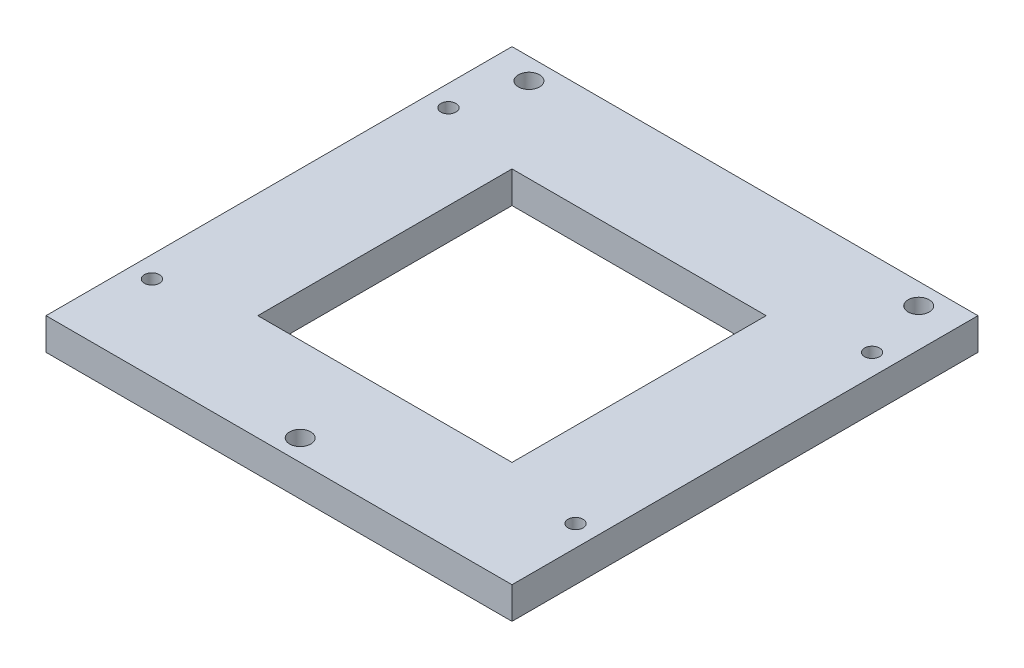
ISO-10303-21;
HEADER;
FILE_DESCRIPTION(('STEP AP214'),'2;1');
FILE_NAME('part.step','',(''),(''),'','','');
FILE_SCHEMA(('AUTOMOTIVE_DESIGN { 1 0 10303 214 1 1 1 1 }'));
ENDSEC;
DATA;
#1=APPLICATION_CONTEXT('core data for automotive mechanical design processes');
#2=APPLICATION_PROTOCOL_DEFINITION('international standard','automotive_design',2000,#1);
#3=PRODUCT_CONTEXT('',#1,'mechanical');
#4=PRODUCT('Part','Part','',(#3));
#5=PRODUCT_RELATED_PRODUCT_CATEGORY('part','',(#4));
#6=PRODUCT_DEFINITION_FORMATION('','',#4);
#7=PRODUCT_DEFINITION_CONTEXT('part definition',#1,'design');
#8=PRODUCT_DEFINITION('design','',#6,#7);
#9=PRODUCT_DEFINITION_SHAPE('','',#8);
#10=(LENGTH_UNIT() NAMED_UNIT(*) SI_UNIT(.MILLI.,.METRE.));
#11=(NAMED_UNIT(*) PLANE_ANGLE_UNIT() SI_UNIT($,.RADIAN.));
#12=(NAMED_UNIT(*) SI_UNIT($,.STERADIAN.) SOLID_ANGLE_UNIT());
#13=UNCERTAINTY_MEASURE_WITH_UNIT(LENGTH_MEASURE(1.E-05),#10,'distance_accuracy_value','');
#14=(GEOMETRIC_REPRESENTATION_CONTEXT(3) GLOBAL_UNCERTAINTY_ASSIGNED_CONTEXT((#13)) GLOBAL_UNIT_ASSIGNED_CONTEXT((#10,
#11,#12)) REPRESENTATION_CONTEXT('',''));
#15=CARTESIAN_POINT('',(0.,0.,0.));
#16=DIRECTION('',(0.,0.,1.));
#17=DIRECTION('',(1.,0.,0.));
#18=AXIS2_PLACEMENT_3D('',#15,#16,#17);
#19=CARTESIAN_POINT('',(34.925,2.38125,-34.925));
#20=DIRECTION('',(-1.,0.,0.));
#21=DIRECTION('',(0.,0.,1.));
#22=AXIS2_PLACEMENT_3D('',#19,#20,#21);
#23=PLANE('',#22);
#24=DIRECTION('',(0.,0.,-1.));
#25=VECTOR('',#24,1.);
#26=CARTESIAN_POINT('',(34.925,-2.38125,-34.925));
#27=LINE('',#26,#25);
#28=CARTESIAN_POINT('',(34.925,-2.38125,34.925));
#29=VERTEX_POINT('',#28);
#30=CARTESIAN_POINT('',(34.925,-2.38125,-34.925));
#31=VERTEX_POINT('',#30);
#32=EDGE_CURVE('E113',#29,#31,#27,.T.);
#33=ORIENTED_EDGE('',*,*,#32,.T.);
#34=DIRECTION('',(0.,-1.,0.));
#35=VECTOR('',#34,1.);
#36=CARTESIAN_POINT('',(34.925,2.38125,-34.925));
#37=LINE('',#36,#35);
#38=CARTESIAN_POINT('',(34.925,2.38125,-34.925));
#39=VERTEX_POINT('',#38);
#40=EDGE_CURVE('E11',#39,#31,#37,.T.);
#41=ORIENTED_EDGE('',*,*,#40,.F.);
#42=DIRECTION('',(0.,0.,-1.));
#43=VECTOR('',#42,1.);
#44=CARTESIAN_POINT('',(34.925,2.38125,-34.925));
#45=LINE('',#44,#43);
#46=CARTESIAN_POINT('',(34.925,2.38125,34.925));
#47=VERTEX_POINT('',#46);
#48=EDGE_CURVE('E136',#47,#39,#45,.T.);
#49=ORIENTED_EDGE('',*,*,#48,.F.);
#50=DIRECTION('',(0.,-1.,0.));
#51=VECTOR('',#50,1.);
#52=CARTESIAN_POINT('',(34.925,2.38125,34.925));
#53=LINE('',#52,#51);
#54=EDGE_CURVE('E146',#47,#29,#53,.T.);
#55=ORIENTED_EDGE('',*,*,#54,.T.);
#56=EDGE_LOOP('',(#33,#41,#49,#55));
#57=FACE_BOUND('',#56,.T.);
#58=ADVANCED_FACE('F35',(#57),#23,.F.);
#59=CARTESIAN_POINT('',(-34.925,2.38125,-34.925));
#60=DIRECTION('',(0.,0.,1.));
#61=DIRECTION('',(1.,0.,0.));
#62=AXIS2_PLACEMENT_3D('',#59,#60,#61);
#63=PLANE('',#62);
#64=DIRECTION('',(-1.,0.,0.));
#65=VECTOR('',#64,1.);
#66=CARTESIAN_POINT('',(-34.925,-2.38125,-34.925));
#67=LINE('',#66,#65);
#68=CARTESIAN_POINT('',(-34.925,-2.38125,-34.925));
#69=VERTEX_POINT('',#68);
#70=EDGE_CURVE('E149',#31,#69,#67,.T.);
#71=ORIENTED_EDGE('',*,*,#70,.T.);
#72=DIRECTION('',(0.,-1.,0.));
#73=VECTOR('',#72,1.);
#74=CARTESIAN_POINT('',(-34.925,2.38125,-34.925));
#75=LINE('',#74,#73);
#76=CARTESIAN_POINT('',(-34.925,2.38125,-34.925));
#77=VERTEX_POINT('',#76);
#78=EDGE_CURVE('E42',#77,#69,#75,.T.);
#79=ORIENTED_EDGE('',*,*,#78,.F.);
#80=DIRECTION('',(-1.,0.,0.));
#81=VECTOR('',#80,1.);
#82=CARTESIAN_POINT('',(-34.925,2.38125,-34.925));
#83=LINE('',#82,#81);
#84=EDGE_CURVE('E139',#39,#77,#83,.T.);
#85=ORIENTED_EDGE('',*,*,#84,.F.);
#86=ORIENTED_EDGE('',*,*,#40,.T.);
#87=EDGE_LOOP('',(#71,#79,#85,#86));
#88=FACE_BOUND('',#87,.T.);
#89=ADVANCED_FACE('F177',(#88),#63,.F.);
#90=CARTESIAN_POINT('',(-34.925,2.38125,-34.925));
#91=DIRECTION('',(1.,0.,0.));
#92=DIRECTION('',(0.,0.,-1.));
#93=AXIS2_PLACEMENT_3D('',#90,#91,#92);
#94=PLANE('',#93);
#95=DIRECTION('',(0.,0.,1.));
#96=VECTOR('',#95,1.);
#97=CARTESIAN_POINT('',(-34.925,-2.38125,-34.925));
#98=LINE('',#97,#96);
#99=CARTESIAN_POINT('',(-34.925,-2.38125,34.925));
#100=VERTEX_POINT('',#99);
#101=EDGE_CURVE('E151',#69,#100,#98,.T.);
#102=ORIENTED_EDGE('',*,*,#101,.T.);
#103=DIRECTION('',(0.,-1.,0.));
#104=VECTOR('',#103,1.);
#105=CARTESIAN_POINT('',(-34.925,2.38125,34.925));
#106=LINE('',#105,#104);
#107=CARTESIAN_POINT('',(-34.925,2.38125,34.925));
#108=VERTEX_POINT('',#107);
#109=EDGE_CURVE('E156',#108,#100,#106,.T.);
#110=ORIENTED_EDGE('',*,*,#109,.F.);
#111=DIRECTION('',(0.,0.,1.));
#112=VECTOR('',#111,1.);
#113=CARTESIAN_POINT('',(-34.925,2.38125,-34.925));
#114=LINE('',#113,#112);
#115=EDGE_CURVE('E142',#77,#108,#114,.T.);
#116=ORIENTED_EDGE('',*,*,#115,.F.);
#117=ORIENTED_EDGE('',*,*,#78,.T.);
#118=EDGE_LOOP('',(#102,#110,#116,#117));
#119=FACE_BOUND('',#118,.T.);
#120=ADVANCED_FACE('F163',(#119),#94,.F.);
#121=CARTESIAN_POINT('',(-34.925,2.38125,34.925));
#122=DIRECTION('',(0.,0.,-1.));
#123=DIRECTION('',(-1.,0.,0.));
#124=AXIS2_PLACEMENT_3D('',#121,#122,#123);
#125=PLANE('',#124);
#126=DIRECTION('',(1.,0.,0.));
#127=VECTOR('',#126,1.);
#128=CARTESIAN_POINT('',(-34.925,-2.38125,34.925));
#129=LINE('',#128,#127);
#130=EDGE_CURVE('E140',#100,#29,#129,.T.);
#131=ORIENTED_EDGE('',*,*,#130,.T.);
#132=ORIENTED_EDGE('',*,*,#54,.F.);
#133=DIRECTION('',(1.,0.,0.));
#134=VECTOR('',#133,1.);
#135=CARTESIAN_POINT('',(-34.925,2.38125,34.925));
#136=LINE('',#135,#134);
#137=EDGE_CURVE('E144',#108,#47,#136,.T.);
#138=ORIENTED_EDGE('',*,*,#137,.F.);
#139=ORIENTED_EDGE('',*,*,#109,.T.);
#140=EDGE_LOOP('',(#131,#132,#138,#139));
#141=FACE_BOUND('',#140,.T.);
#142=ADVANCED_FACE('F170',(#141),#125,.F.);
#143=CARTESIAN_POINT('',(0.,2.38125,0.));
#144=DIRECTION('',(0.,1.,0.));
#145=DIRECTION('',(0.,0.,1.));
#146=AXIS2_PLACEMENT_3D('',#143,#144,#145);
#147=PLANE('',#146);
#148=CARTESIAN_POINT('',(-31.75,2.38125,22.225));
#149=DIRECTION('',(0.,1.,0.));
#150=DIRECTION('',(0.,0.,1.));
#151=AXIS2_PLACEMENT_3D('',#148,#149,#150);
#152=CIRCLE('',#151,1.1303);
#153=CARTESIAN_POINT('',(-31.75,2.38125,23.3553));
#154=VERTEX_POINT('',#153);
#155=EDGE_CURVE('E239',#154,#154,#152,.T.);
#156=ORIENTED_EDGE('',*,*,#155,.F.);
#157=EDGE_LOOP('',(#156));
#158=FACE_BOUND('',#157,.T.);
#159=CARTESIAN_POINT('',(31.75,2.38125,22.225));
#160=DIRECTION('',(0.,1.,0.));
#161=DIRECTION('',(0.,0.,1.));
#162=AXIS2_PLACEMENT_3D('',#159,#160,#161);
#163=CIRCLE('',#162,1.1303);
#164=CARTESIAN_POINT('',(31.75,2.38125,23.3553));
#165=VERTEX_POINT('',#164);
#166=EDGE_CURVE('E241',#165,#165,#163,.T.);
#167=ORIENTED_EDGE('',*,*,#166,.F.);
#168=EDGE_LOOP('',(#167));
#169=FACE_BOUND('',#168,.T.);
#170=CARTESIAN_POINT('',(-29.21,2.38125,-31.75));
#171=DIRECTION('',(0.,1.,0.));
#172=DIRECTION('',(0.,0.,1.));
#173=AXIS2_PLACEMENT_3D('',#170,#171,#172);
#174=CIRCLE('',#173,1.5875);
#175=CARTESIAN_POINT('',(-29.21,2.38125,-30.1625));
#176=VERTEX_POINT('',#175);
#177=EDGE_CURVE('E249',#176,#176,#174,.T.);
#178=ORIENTED_EDGE('',*,*,#177,.F.);
#179=EDGE_LOOP('',(#178));
#180=FACE_BOUND('',#179,.T.);
#181=CARTESIAN_POINT('',(29.21,2.38125,-31.75));
#182=DIRECTION('',(0.,1.,0.));
#183=DIRECTION('',(0.,0.,1.));
#184=AXIS2_PLACEMENT_3D('',#181,#182,#183);
#185=CIRCLE('',#184,1.5875);
#186=CARTESIAN_POINT('',(29.21,2.38125,-30.1625));
#187=VERTEX_POINT('',#186);
#188=EDGE_CURVE('E255',#187,#187,#185,.T.);
#189=ORIENTED_EDGE('',*,*,#188,.F.);
#190=EDGE_LOOP('',(#189));
#191=FACE_BOUND('',#190,.T.);
#192=CARTESIAN_POINT('',(0.,2.38125,31.75));
#193=DIRECTION('',(0.,1.,0.));
#194=DIRECTION('',(0.,0.,1.));
#195=AXIS2_PLACEMENT_3D('',#192,#193,#194);
#196=CIRCLE('',#195,1.5875);
#197=CARTESIAN_POINT('',(0.,2.38125,33.3375));
#198=VERTEX_POINT('',#197);
#199=EDGE_CURVE('E261',#198,#198,#196,.T.);
#200=ORIENTED_EDGE('',*,*,#199,.F.);
#201=EDGE_LOOP('',(#200));
#202=FACE_BOUND('',#201,.T.);
#203=CARTESIAN_POINT('',(-31.75,2.38125,-22.225));
#204=DIRECTION('',(0.,1.,0.));
#205=DIRECTION('',(0.,0.,1.));
#206=AXIS2_PLACEMENT_3D('',#203,#204,#205);
#207=CIRCLE('',#206,1.1303);
#208=CARTESIAN_POINT('',(-31.75,2.38125,-21.0947));
#209=VERTEX_POINT('',#208);
#210=EDGE_CURVE('E267',#209,#209,#207,.T.);
#211=ORIENTED_EDGE('',*,*,#210,.F.);
#212=EDGE_LOOP('',(#211));
#213=FACE_BOUND('',#212,.T.);
#214=CARTESIAN_POINT('',(31.75,2.38125,-22.225));
#215=DIRECTION('',(0.,1.,0.));
#216=DIRECTION('',(0.,0.,1.));
#217=AXIS2_PLACEMENT_3D('',#214,#215,#216);
#218=CIRCLE('',#217,1.1303);
#219=CARTESIAN_POINT('',(31.75,2.38125,-21.0947));
#220=VERTEX_POINT('',#219);
#221=EDGE_CURVE('E273',#220,#220,#218,.T.);
#222=ORIENTED_EDGE('',*,*,#221,.F.);
#223=EDGE_LOOP('',(#222));
#224=FACE_BOUND('',#223,.T.);
#225=DIRECTION('',(0.,0.,-1.));
#226=VECTOR('',#225,1.);
#227=CARTESIAN_POINT('',(19.05,2.38125,-19.05));
#228=LINE('',#227,#226);
#229=CARTESIAN_POINT('',(19.05,2.38125,19.05));
#230=VERTEX_POINT('',#229);
#231=CARTESIAN_POINT('',(19.05,2.38125,-19.05));
#232=VERTEX_POINT('',#231);
#233=EDGE_CURVE('E49',#230,#232,#228,.T.);
#234=ORIENTED_EDGE('',*,*,#233,.F.);
#235=DIRECTION('',(1.,0.,0.));
#236=VECTOR('',#235,1.);
#237=CARTESIAN_POINT('',(-19.05,2.38125,19.05));
#238=LINE('',#237,#236);
#239=CARTESIAN_POINT('',(-19.05,2.38125,19.05));
#240=VERTEX_POINT('',#239);
#241=EDGE_CURVE('E107',#240,#230,#238,.T.);
#242=ORIENTED_EDGE('',*,*,#241,.F.);
#243=DIRECTION('',(0.,0.,1.));
#244=VECTOR('',#243,1.);
#245=CARTESIAN_POINT('',(-19.05,2.38125,-19.05));
#246=LINE('',#245,#244);
#247=CARTESIAN_POINT('',(-19.05,2.38125,-19.05));
#248=VERTEX_POINT('',#247);
#249=EDGE_CURVE('E127',#248,#240,#246,.T.);
#250=ORIENTED_EDGE('',*,*,#249,.F.);
#251=DIRECTION('',(-1.,0.,0.));
#252=VECTOR('',#251,1.);
#253=CARTESIAN_POINT('',(-19.05,2.38125,-19.05));
#254=LINE('',#253,#252);
#255=EDGE_CURVE('E121',#232,#248,#254,.T.);
#256=ORIENTED_EDGE('',*,*,#255,.F.);
#257=EDGE_LOOP('',(#234,#242,#250,#256));
#258=FACE_BOUND('',#257,.T.);
#259=ORIENTED_EDGE('',*,*,#48,.T.);
#260=ORIENTED_EDGE('',*,*,#84,.T.);
#261=ORIENTED_EDGE('',*,*,#115,.T.);
#262=ORIENTED_EDGE('',*,*,#137,.T.);
#263=EDGE_LOOP('',(#259,#260,#261,#262));
#264=FACE_BOUND('',#263,.T.);
#265=ADVANCED_FACE('F176',(#158,#169,#180,#191,#202,#213,#224,#258,#264),#147,.T.);
#266=CARTESIAN_POINT('',(0.,-2.38125,0.));
#267=DIRECTION('',(0.,1.,0.));
#268=DIRECTION('',(0.,0.,1.));
#269=AXIS2_PLACEMENT_3D('',#266,#267,#268);
#270=PLANE('',#269);
#271=CARTESIAN_POINT('',(-31.75,-2.38125,22.225));
#272=DIRECTION('',(0.,1.,0.));
#273=DIRECTION('',(0.,0.,1.));
#274=AXIS2_PLACEMENT_3D('',#271,#272,#273);
#275=CIRCLE('',#274,1.1303);
#276=CARTESIAN_POINT('',(-31.75,-2.38125,23.3553));
#277=VERTEX_POINT('',#276);
#278=EDGE_CURVE('E236',#277,#277,#275,.T.);
#279=ORIENTED_EDGE('',*,*,#278,.T.);
#280=EDGE_LOOP('',(#279));
#281=FACE_BOUND('',#280,.T.);
#282=CARTESIAN_POINT('',(31.75,-2.38125,22.225));
#283=DIRECTION('',(0.,1.,0.));
#284=DIRECTION('',(0.,0.,1.));
#285=AXIS2_PLACEMENT_3D('',#282,#283,#284);
#286=CIRCLE('',#285,1.1303);
#287=CARTESIAN_POINT('',(31.75,-2.38125,23.3553));
#288=VERTEX_POINT('',#287);
#289=EDGE_CURVE('E246',#288,#288,#286,.T.);
#290=ORIENTED_EDGE('',*,*,#289,.T.);
#291=EDGE_LOOP('',(#290));
#292=FACE_BOUND('',#291,.T.);
#293=CARTESIAN_POINT('',(-29.21,-2.38125,-31.75));
#294=DIRECTION('',(0.,1.,0.));
#295=DIRECTION('',(0.,0.,1.));
#296=AXIS2_PLACEMENT_3D('',#293,#294,#295);
#297=CIRCLE('',#296,1.5875);
#298=CARTESIAN_POINT('',(-29.21,-2.38125,-30.1625));
#299=VERTEX_POINT('',#298);
#300=EDGE_CURVE('E252',#299,#299,#297,.T.);
#301=ORIENTED_EDGE('',*,*,#300,.T.);
#302=EDGE_LOOP('',(#301));
#303=FACE_BOUND('',#302,.T.);
#304=CARTESIAN_POINT('',(29.21,-2.38125,-31.75));
#305=DIRECTION('',(0.,1.,0.));
#306=DIRECTION('',(0.,0.,1.));
#307=AXIS2_PLACEMENT_3D('',#304,#305,#306);
#308=CIRCLE('',#307,1.5875);
#309=CARTESIAN_POINT('',(29.21,-2.38125,-30.1625));
#310=VERTEX_POINT('',#309);
#311=EDGE_CURVE('E258',#310,#310,#308,.T.);
#312=ORIENTED_EDGE('',*,*,#311,.T.);
#313=EDGE_LOOP('',(#312));
#314=FACE_BOUND('',#313,.T.);
#315=CARTESIAN_POINT('',(0.,-2.38125,31.75));
#316=DIRECTION('',(0.,1.,0.));
#317=DIRECTION('',(0.,0.,1.));
#318=AXIS2_PLACEMENT_3D('',#315,#316,#317);
#319=CIRCLE('',#318,1.5875);
#320=CARTESIAN_POINT('',(0.,-2.38125,33.3375));
#321=VERTEX_POINT('',#320);
#322=EDGE_CURVE('E264',#321,#321,#319,.T.);
#323=ORIENTED_EDGE('',*,*,#322,.T.);
#324=EDGE_LOOP('',(#323));
#325=FACE_BOUND('',#324,.T.);
#326=CARTESIAN_POINT('',(-31.75,-2.38125,-22.225));
#327=DIRECTION('',(0.,1.,0.));
#328=DIRECTION('',(0.,0.,1.));
#329=AXIS2_PLACEMENT_3D('',#326,#327,#328);
#330=CIRCLE('',#329,1.1303);
#331=CARTESIAN_POINT('',(-31.75,-2.38125,-21.0947));
#332=VERTEX_POINT('',#331);
#333=EDGE_CURVE('E270',#332,#332,#330,.T.);
#334=ORIENTED_EDGE('',*,*,#333,.T.);
#335=EDGE_LOOP('',(#334));
#336=FACE_BOUND('',#335,.T.);
#337=CARTESIAN_POINT('',(31.75,-2.38125,-22.225));
#338=DIRECTION('',(0.,1.,0.));
#339=DIRECTION('',(0.,0.,1.));
#340=AXIS2_PLACEMENT_3D('',#337,#338,#339);
#341=CIRCLE('',#340,1.1303);
#342=CARTESIAN_POINT('',(31.75,-2.38125,-21.0947));
#343=VERTEX_POINT('',#342);
#344=EDGE_CURVE('E276',#343,#343,#341,.T.);
#345=ORIENTED_EDGE('',*,*,#344,.T.);
#346=EDGE_LOOP('',(#345));
#347=FACE_BOUND('',#346,.T.);
#348=DIRECTION('',(-1.,0.,0.));
#349=VECTOR('',#348,1.);
#350=CARTESIAN_POINT('',(-19.05,-2.38125,19.05));
#351=LINE('',#350,#349);
#352=CARTESIAN_POINT('',(19.05,-2.38125,19.05));
#353=VERTEX_POINT('',#352);
#354=CARTESIAN_POINT('',(-19.05,-2.38125,19.05));
#355=VERTEX_POINT('',#354);
#356=EDGE_CURVE('E119',#353,#355,#351,.T.);
#357=ORIENTED_EDGE('',*,*,#356,.F.);
#358=DIRECTION('',(0.,0.,1.));
#359=VECTOR('',#358,1.);
#360=CARTESIAN_POINT('',(19.05,-2.38125,-19.05));
#361=LINE('',#360,#359);
#362=CARTESIAN_POINT('',(19.05,-2.38125,-19.05));
#363=VERTEX_POINT('',#362);
#364=EDGE_CURVE('E101',#363,#353,#361,.T.);
#365=ORIENTED_EDGE('',*,*,#364,.F.);
#366=DIRECTION('',(1.,0.,0.));
#367=VECTOR('',#366,1.);
#368=CARTESIAN_POINT('',(-19.05,-2.38125,-19.05));
#369=LINE('',#368,#367);
#370=CARTESIAN_POINT('',(-19.05,-2.38125,-19.05));
#371=VERTEX_POINT('',#370);
#372=EDGE_CURVE('E110',#371,#363,#369,.T.);
#373=ORIENTED_EDGE('',*,*,#372,.F.);
#374=DIRECTION('',(0.,0.,-1.));
#375=VECTOR('',#374,1.);
#376=CARTESIAN_POINT('',(-19.05,-2.38125,-19.05));
#377=LINE('',#376,#375);
#378=EDGE_CURVE('E57',#355,#371,#377,.T.);
#379=ORIENTED_EDGE('',*,*,#378,.F.);
#380=EDGE_LOOP('',(#357,#365,#373,#379));
#381=FACE_BOUND('',#380,.T.);
#382=ORIENTED_EDGE('',*,*,#32,.F.);
#383=ORIENTED_EDGE('',*,*,#130,.F.);
#384=ORIENTED_EDGE('',*,*,#101,.F.);
#385=ORIENTED_EDGE('',*,*,#70,.F.);
#386=EDGE_LOOP('',(#382,#383,#384,#385));
#387=FACE_BOUND('',#386,.T.);
#388=ADVANCED_FACE('F116',(#281,#292,#303,#314,#325,#336,#347,#381,#387),#270,.F.);
#389=CARTESIAN_POINT('',(19.05,-2.38225,-19.05));
#390=DIRECTION('',(1.,0.,0.));
#391=DIRECTION('',(0.,0.,-1.));
#392=AXIS2_PLACEMENT_3D('',#389,#390,#391);
#393=PLANE('',#392);
#394=ORIENTED_EDGE('',*,*,#364,.T.);
#395=DIRECTION('',(0.,1.,0.));
#396=VECTOR('',#395,1.);
#397=CARTESIAN_POINT('',(19.05,-2.38225,19.05));
#398=LINE('',#397,#396);
#399=EDGE_CURVE('E114',#353,#230,#398,.T.);
#400=ORIENTED_EDGE('',*,*,#399,.T.);
#401=ORIENTED_EDGE('',*,*,#233,.T.);
#402=DIRECTION('',(0.,1.,0.));
#403=VECTOR('',#402,1.);
#404=CARTESIAN_POINT('',(19.05,-2.38225,-19.05));
#405=LINE('',#404,#403);
#406=EDGE_CURVE('E97',#363,#232,#405,.T.);
#407=ORIENTED_EDGE('',*,*,#406,.F.);
#408=EDGE_LOOP('',(#394,#400,#401,#407));
#409=FACE_BOUND('',#408,.T.);
#410=ADVANCED_FACE('F99',(#409),#393,.F.);
#411=CARTESIAN_POINT('',(-19.05,-2.38225,19.05));
#412=DIRECTION('',(0.,0.,1.));
#413=DIRECTION('',(1.,0.,0.));
#414=AXIS2_PLACEMENT_3D('',#411,#412,#413);
#415=PLANE('',#414);
#416=ORIENTED_EDGE('',*,*,#356,.T.);
#417=DIRECTION('',(0.,1.,0.));
#418=VECTOR('',#417,1.);
#419=CARTESIAN_POINT('',(-19.05,-2.38225,19.05));
#420=LINE('',#419,#418);
#421=EDGE_CURVE('E133',#355,#240,#420,.T.);
#422=ORIENTED_EDGE('',*,*,#421,.T.);
#423=ORIENTED_EDGE('',*,*,#241,.T.);
#424=ORIENTED_EDGE('',*,*,#399,.F.);
#425=EDGE_LOOP('',(#416,#422,#423,#424));
#426=FACE_BOUND('',#425,.T.);
#427=ADVANCED_FACE('F195',(#426),#415,.F.);
#428=CARTESIAN_POINT('',(-19.05,-2.38225,-19.05));
#429=DIRECTION('',(-1.,0.,0.));
#430=DIRECTION('',(0.,0.,1.));
#431=AXIS2_PLACEMENT_3D('',#428,#429,#430);
#432=PLANE('',#431);
#433=ORIENTED_EDGE('',*,*,#378,.T.);
#434=DIRECTION('',(0.,1.,0.));
#435=VECTOR('',#434,1.);
#436=CARTESIAN_POINT('',(-19.05,-2.38225,-19.05));
#437=LINE('',#436,#435);
#438=EDGE_CURVE('E106',#371,#248,#437,.T.);
#439=ORIENTED_EDGE('',*,*,#438,.T.);
#440=ORIENTED_EDGE('',*,*,#249,.T.);
#441=ORIENTED_EDGE('',*,*,#421,.F.);
#442=EDGE_LOOP('',(#433,#439,#440,#441));
#443=FACE_BOUND('',#442,.T.);
#444=ADVANCED_FACE('F199',(#443),#432,.F.);
#445=CARTESIAN_POINT('',(-19.05,-2.38225,-19.05));
#446=DIRECTION('',(0.,0.,-1.));
#447=DIRECTION('',(-1.,0.,0.));
#448=AXIS2_PLACEMENT_3D('',#445,#446,#447);
#449=PLANE('',#448);
#450=ORIENTED_EDGE('',*,*,#372,.T.);
#451=ORIENTED_EDGE('',*,*,#406,.T.);
#452=ORIENTED_EDGE('',*,*,#255,.T.);
#453=ORIENTED_EDGE('',*,*,#438,.F.);
#454=EDGE_LOOP('',(#450,#451,#452,#453));
#455=FACE_BOUND('',#454,.T.);
#456=ADVANCED_FACE('F111',(#455),#449,.F.);
#457=CARTESIAN_POINT('',(31.75,2.38125,-22.225));
#458=DIRECTION('',(0.,1.,0.));
#459=DIRECTION('',(0.,0.,1.));
#460=AXIS2_PLACEMENT_3D('',#457,#458,#459);
#461=CYLINDRICAL_SURFACE('',#460,1.1303);
#462=ORIENTED_EDGE('',*,*,#344,.F.);
#463=EDGE_LOOP('',(#462));
#464=FACE_BOUND('',#463,.T.);
#465=ORIENTED_EDGE('',*,*,#221,.T.);
#466=EDGE_LOOP('',(#465));
#467=FACE_BOUND('',#466,.T.);
#468=ADVANCED_FACE('F198',(#464,#467),#461,.F.);
#469=CARTESIAN_POINT('',(-31.75,2.38125,-22.225));
#470=DIRECTION('',(0.,1.,0.));
#471=DIRECTION('',(0.,0.,1.));
#472=AXIS2_PLACEMENT_3D('',#469,#470,#471);
#473=CYLINDRICAL_SURFACE('',#472,1.1303);
#474=ORIENTED_EDGE('',*,*,#333,.F.);
#475=EDGE_LOOP('',(#474));
#476=FACE_BOUND('',#475,.T.);
#477=ORIENTED_EDGE('',*,*,#210,.T.);
#478=EDGE_LOOP('',(#477));
#479=FACE_BOUND('',#478,.T.);
#480=ADVANCED_FACE('F207',(#476,#479),#473,.F.);
#481=CARTESIAN_POINT('',(0.,2.38125,31.75));
#482=DIRECTION('',(0.,1.,0.));
#483=DIRECTION('',(0.,0.,1.));
#484=AXIS2_PLACEMENT_3D('',#481,#482,#483);
#485=CYLINDRICAL_SURFACE('',#484,1.5875);
#486=ORIENTED_EDGE('',*,*,#322,.F.);
#487=EDGE_LOOP('',(#486));
#488=FACE_BOUND('',#487,.T.);
#489=ORIENTED_EDGE('',*,*,#199,.T.);
#490=EDGE_LOOP('',(#489));
#491=FACE_BOUND('',#490,.T.);
#492=ADVANCED_FACE('F211',(#488,#491),#485,.F.);
#493=CARTESIAN_POINT('',(29.21,2.38125,-31.75));
#494=DIRECTION('',(0.,1.,0.));
#495=DIRECTION('',(0.,0.,1.));
#496=AXIS2_PLACEMENT_3D('',#493,#494,#495);
#497=CYLINDRICAL_SURFACE('',#496,1.5875);
#498=ORIENTED_EDGE('',*,*,#311,.F.);
#499=EDGE_LOOP('',(#498));
#500=FACE_BOUND('',#499,.T.);
#501=ORIENTED_EDGE('',*,*,#188,.T.);
#502=EDGE_LOOP('',(#501));
#503=FACE_BOUND('',#502,.T.);
#504=ADVANCED_FACE('F215',(#500,#503),#497,.F.);
#505=CARTESIAN_POINT('',(-29.21,2.38125,-31.75));
#506=DIRECTION('',(0.,1.,0.));
#507=DIRECTION('',(0.,0.,1.));
#508=AXIS2_PLACEMENT_3D('',#505,#506,#507);
#509=CYLINDRICAL_SURFACE('',#508,1.5875);
#510=ORIENTED_EDGE('',*,*,#300,.F.);
#511=EDGE_LOOP('',(#510));
#512=FACE_BOUND('',#511,.T.);
#513=ORIENTED_EDGE('',*,*,#177,.T.);
#514=EDGE_LOOP('',(#513));
#515=FACE_BOUND('',#514,.T.);
#516=ADVANCED_FACE('F219',(#512,#515),#509,.F.);
#517=CARTESIAN_POINT('',(31.75,2.38125,22.225));
#518=DIRECTION('',(0.,1.,0.));
#519=DIRECTION('',(0.,0.,1.));
#520=AXIS2_PLACEMENT_3D('',#517,#518,#519);
#521=CYLINDRICAL_SURFACE('',#520,1.1303);
#522=ORIENTED_EDGE('',*,*,#289,.F.);
#523=EDGE_LOOP('',(#522));
#524=FACE_BOUND('',#523,.T.);
#525=ORIENTED_EDGE('',*,*,#166,.T.);
#526=EDGE_LOOP('',(#525));
#527=FACE_BOUND('',#526,.T.);
#528=ADVANCED_FACE('F223',(#524,#527),#521,.F.);
#529=CARTESIAN_POINT('',(-31.75,2.38125,22.225));
#530=DIRECTION('',(0.,1.,0.));
#531=DIRECTION('',(0.,0.,1.));
#532=AXIS2_PLACEMENT_3D('',#529,#530,#531);
#533=CYLINDRICAL_SURFACE('',#532,1.1303);
#534=ORIENTED_EDGE('',*,*,#278,.F.);
#535=EDGE_LOOP('',(#534));
#536=FACE_BOUND('',#535,.T.);
#537=ORIENTED_EDGE('',*,*,#155,.T.);
#538=EDGE_LOOP('',(#537));
#539=FACE_BOUND('',#538,.T.);
#540=ADVANCED_FACE('F227',(#536,#539),#533,.F.);
#541=CLOSED_SHELL('',(#58,#89,#120,#142,#265,#388,#410,#427,#444,#456,#468,#480,#492,#504,#516,
#528,#540));
#542=MANIFOLD_SOLID_BREP('B2',#541);
#543=ADVANCED_BREP_SHAPE_REPRESENTATION('',(#18,#542),#14);
#544=SHAPE_DEFINITION_REPRESENTATION(#9,#543);
ENDSEC;
END-ISO-10303-21;
